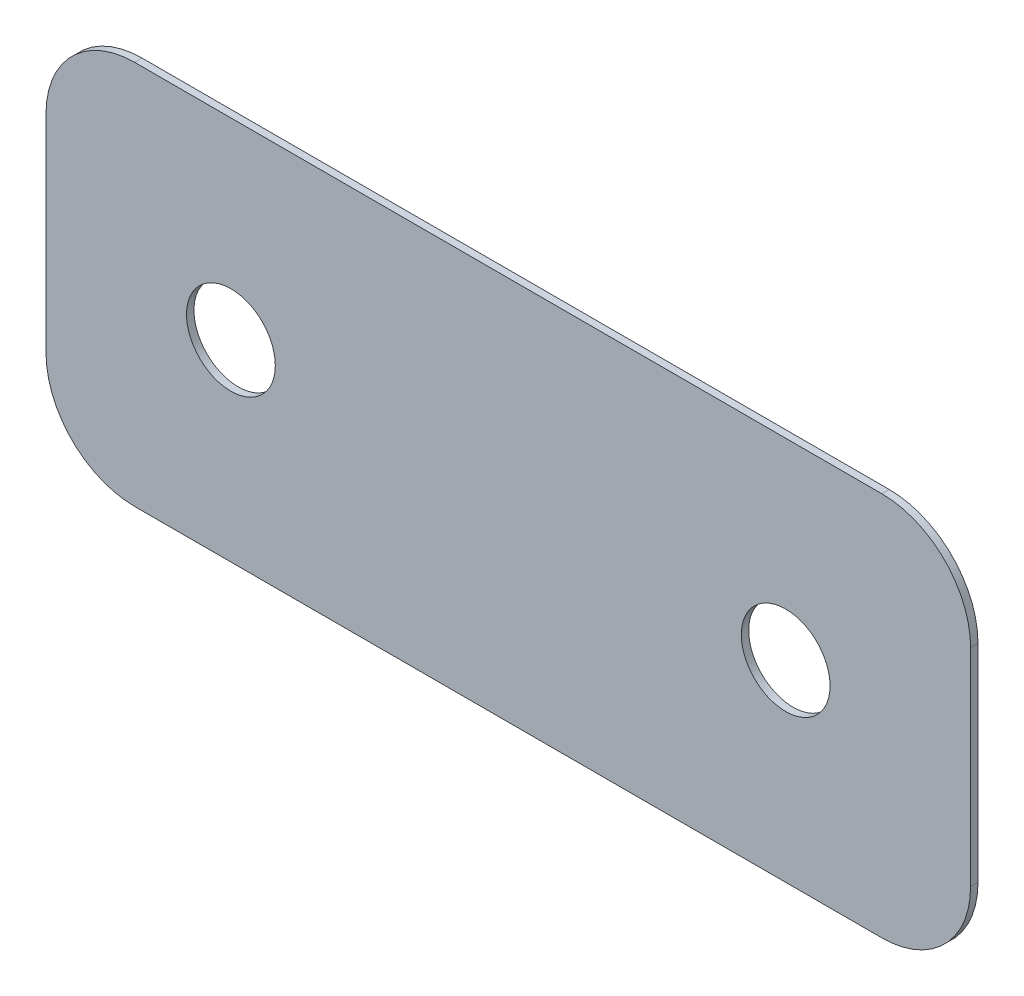
ISO-10303-21;
HEADER;
FILE_DESCRIPTION(('STEP AP214'),'2;1');
FILE_NAME('part.step','',(''),(''),'','','');
FILE_SCHEMA(('AUTOMOTIVE_DESIGN { 1 0 10303 214 1 1 1 1 }'));
ENDSEC;
DATA;
#1=APPLICATION_CONTEXT('core data for automotive mechanical design processes');
#2=APPLICATION_PROTOCOL_DEFINITION('international standard','automotive_design',2000,#1);
#3=PRODUCT_CONTEXT('',#1,'mechanical');
#4=PRODUCT('Part','Part','',(#3));
#5=PRODUCT_RELATED_PRODUCT_CATEGORY('part','',(#4));
#6=PRODUCT_DEFINITION_FORMATION('','',#4);
#7=PRODUCT_DEFINITION_CONTEXT('part definition',#1,'design');
#8=PRODUCT_DEFINITION('design','',#6,#7);
#9=PRODUCT_DEFINITION_SHAPE('','',#8);
#10=(LENGTH_UNIT() NAMED_UNIT(*) SI_UNIT(.MILLI.,.METRE.));
#11=(NAMED_UNIT(*) PLANE_ANGLE_UNIT() SI_UNIT($,.RADIAN.));
#12=(NAMED_UNIT(*) SI_UNIT($,.STERADIAN.) SOLID_ANGLE_UNIT());
#13=UNCERTAINTY_MEASURE_WITH_UNIT(LENGTH_MEASURE(1.E-05),#10,'distance_accuracy_value','');
#14=(GEOMETRIC_REPRESENTATION_CONTEXT(3) GLOBAL_UNCERTAINTY_ASSIGNED_CONTEXT((#13)) GLOBAL_UNIT_ASSIGNED_CONTEXT((#10,
#11,#12)) REPRESENTATION_CONTEXT('',''));
#15=CARTESIAN_POINT('',(0.,0.,0.));
#16=DIRECTION('',(0.,0.,1.));
#17=DIRECTION('',(1.,0.,0.));
#18=AXIS2_PLACEMENT_3D('',#15,#16,#17);
#19=CARTESIAN_POINT('',(50.5,14.,1.));
#20=DIRECTION('',(0.,0.,-1.));
#21=DIRECTION('',(-1.,0.,0.));
#22=AXIS2_PLACEMENT_3D('',#19,#20,#21);
#23=PLANE('',#22);
#24=CARTESIAN_POINT('',(50.5,14.,1.));
#25=DIRECTION('',(0.,0.,1.));
#26=DIRECTION('',(-1.,0.,0.));
#27=AXIS2_PLACEMENT_3D('',#24,#25,#26);
#28=CIRCLE('',#27,12.);
#29=CARTESIAN_POINT('',(62.5,13.9999999999999,1.));
#30=VERTEX_POINT('',#29);
#31=CARTESIAN_POINT('',(50.4999999999999,26.,1.));
#32=VERTEX_POINT('',#31);
#33=EDGE_CURVE('E152',#30,#32,#28,.T.);
#34=ORIENTED_EDGE('',*,*,#33,.T.);
#35=DIRECTION('',(-1.,0.,0.));
#36=VECTOR('',#35,1.);
#37=CARTESIAN_POINT('',(-50.4999999999999,26.,1.));
#38=LINE('',#37,#36);
#39=CARTESIAN_POINT('',(-50.4999999999999,26.,1.));
#40=VERTEX_POINT('',#39);
#41=EDGE_CURVE('E98',#32,#40,#38,.T.);
#42=ORIENTED_EDGE('',*,*,#41,.T.);
#43=CARTESIAN_POINT('',(-50.5,14.,1.));
#44=DIRECTION('',(0.,0.,1.));
#45=DIRECTION('',(1.,0.,0.));
#46=AXIS2_PLACEMENT_3D('',#43,#44,#45);
#47=CIRCLE('',#46,12.);
#48=CARTESIAN_POINT('',(-62.5,13.9999999999999,1.));
#49=VERTEX_POINT('',#48);
#50=EDGE_CURVE('E168',#40,#49,#47,.T.);
#51=ORIENTED_EDGE('',*,*,#50,.T.);
#52=DIRECTION('',(0.,-1.,0.));
#53=VECTOR('',#52,1.);
#54=CARTESIAN_POINT('',(-62.5,13.9999999999999,1.));
#55=LINE('',#54,#53);
#56=CARTESIAN_POINT('',(-62.5,-13.9999999999999,1.));
#57=VERTEX_POINT('',#56);
#58=EDGE_CURVE('E177',#49,#57,#55,.T.);
#59=ORIENTED_EDGE('',*,*,#58,.T.);
#60=CARTESIAN_POINT('',(-50.5,-14.,1.));
#61=DIRECTION('',(0.,0.,1.));
#62=DIRECTION('',(1.,0.,0.));
#63=AXIS2_PLACEMENT_3D('',#60,#61,#62);
#64=CIRCLE('',#63,12.);
#65=CARTESIAN_POINT('',(-50.4999999999999,-26.,1.));
#66=VERTEX_POINT('',#65);
#67=EDGE_CURVE('E120',#57,#66,#64,.T.);
#68=ORIENTED_EDGE('',*,*,#67,.T.);
#69=DIRECTION('',(1.,0.,0.));
#70=VECTOR('',#69,1.);
#71=CARTESIAN_POINT('',(-50.4999999999999,-26.,1.));
#72=LINE('',#71,#70);
#73=CARTESIAN_POINT('',(50.4999999999999,-26.,1.));
#74=VERTEX_POINT('',#73);
#75=EDGE_CURVE('E115',#66,#74,#72,.T.);
#76=ORIENTED_EDGE('',*,*,#75,.T.);
#77=CARTESIAN_POINT('',(50.5,-14.,1.));
#78=DIRECTION('',(0.,0.,1.));
#79=DIRECTION('',(1.,0.,0.));
#80=AXIS2_PLACEMENT_3D('',#77,#78,#79);
#81=CIRCLE('',#80,12.);
#82=CARTESIAN_POINT('',(62.5,-14.,1.));
#83=VERTEX_POINT('',#82);
#84=EDGE_CURVE('E117',#74,#83,#81,.T.);
#85=ORIENTED_EDGE('',*,*,#84,.T.);
#86=DIRECTION('',(0.,1.,0.));
#87=VECTOR('',#86,1.);
#88=CARTESIAN_POINT('',(62.5,13.9999999999999,1.));
#89=LINE('',#88,#87);
#90=EDGE_CURVE('E57',#83,#30,#89,.T.);
#91=ORIENTED_EDGE('',*,*,#90,.T.);
#92=EDGE_LOOP('',(#34,#42,#51,#59,#68,#76,#85,#91));
#93=FACE_BOUND('',#92,.T.);
#94=CARTESIAN_POINT('',(-37.5,0.,1.));
#95=DIRECTION('',(0.,0.,1.));
#96=DIRECTION('',(1.,0.,0.));
#97=AXIS2_PLACEMENT_3D('',#94,#95,#96);
#98=CIRCLE('',#97,5.99999999999999);
#99=CARTESIAN_POINT('',(-31.5,0.,1.));
#100=VERTEX_POINT('',#99);
#101=EDGE_CURVE('E139',#100,#100,#98,.T.);
#102=ORIENTED_EDGE('',*,*,#101,.F.);
#103=EDGE_LOOP('',(#102));
#104=FACE_BOUND('',#103,.T.);
#105=CARTESIAN_POINT('',(37.5,0.,1.));
#106=DIRECTION('',(0.,0.,1.));
#107=DIRECTION('',(1.,0.,0.));
#108=AXIS2_PLACEMENT_3D('',#105,#106,#107);
#109=CIRCLE('',#108,6.00000000000001);
#110=CARTESIAN_POINT('',(43.5,0.,1.));
#111=VERTEX_POINT('',#110);
#112=EDGE_CURVE('E187',#111,#111,#109,.T.);
#113=ORIENTED_EDGE('',*,*,#112,.F.);
#114=EDGE_LOOP('',(#113));
#115=FACE_BOUND('',#114,.T.);
#116=ADVANCED_FACE('F39',(#93,#104,#115),#23,.F.);
#117=CARTESIAN_POINT('',(50.5,14.,0.));
#118=DIRECTION('',(0.,0.,-1.));
#119=DIRECTION('',(-1.,0.,0.));
#120=AXIS2_PLACEMENT_3D('',#117,#118,#119);
#121=PLANE('',#120);
#122=CARTESIAN_POINT('',(-37.5,0.,0.));
#123=DIRECTION('',(0.,0.,1.));
#124=DIRECTION('',(1.,0.,0.));
#125=AXIS2_PLACEMENT_3D('',#122,#123,#124);
#126=CIRCLE('',#125,5.99999999999999);
#127=CARTESIAN_POINT('',(-31.5,0.,0.));
#128=VERTEX_POINT('',#127);
#129=EDGE_CURVE('E184',#128,#128,#126,.T.);
#130=ORIENTED_EDGE('',*,*,#129,.T.);
#131=EDGE_LOOP('',(#130));
#132=FACE_BOUND('',#131,.T.);
#133=CARTESIAN_POINT('',(50.5,14.,0.));
#134=DIRECTION('',(0.,0.,1.));
#135=DIRECTION('',(-1.,0.,0.));
#136=AXIS2_PLACEMENT_3D('',#133,#134,#135);
#137=CIRCLE('',#136,12.);
#138=CARTESIAN_POINT('',(62.5,13.9999999999999,0.));
#139=VERTEX_POINT('',#138);
#140=CARTESIAN_POINT('',(50.4999999999999,26.,0.));
#141=VERTEX_POINT('',#140);
#142=EDGE_CURVE('E136',#139,#141,#137,.T.);
#143=ORIENTED_EDGE('',*,*,#142,.F.);
#144=DIRECTION('',(0.,1.,0.));
#145=VECTOR('',#144,1.);
#146=CARTESIAN_POINT('',(62.5,13.9999999999999,0.));
#147=LINE('',#146,#145);
#148=CARTESIAN_POINT('',(62.5,-14.,0.));
#149=VERTEX_POINT('',#148);
#150=EDGE_CURVE('E91',#149,#139,#147,.T.);
#151=ORIENTED_EDGE('',*,*,#150,.F.);
#152=CARTESIAN_POINT('',(50.5,-14.,0.));
#153=DIRECTION('',(0.,0.,1.));
#154=DIRECTION('',(1.,0.,0.));
#155=AXIS2_PLACEMENT_3D('',#152,#153,#154);
#156=CIRCLE('',#155,12.);
#157=CARTESIAN_POINT('',(50.4999999999999,-26.,0.));
#158=VERTEX_POINT('',#157);
#159=EDGE_CURVE('E82',#158,#149,#156,.T.);
#160=ORIENTED_EDGE('',*,*,#159,.F.);
#161=DIRECTION('',(1.,0.,0.));
#162=VECTOR('',#161,1.);
#163=CARTESIAN_POINT('',(-50.4999999999999,-26.,0.));
#164=LINE('',#163,#162);
#165=CARTESIAN_POINT('',(-50.4999999999999,-26.,0.));
#166=VERTEX_POINT('',#165);
#167=EDGE_CURVE('E128',#166,#158,#164,.T.);
#168=ORIENTED_EDGE('',*,*,#167,.F.);
#169=CARTESIAN_POINT('',(-50.5,-14.,0.));
#170=DIRECTION('',(0.,0.,1.));
#171=DIRECTION('',(1.,0.,0.));
#172=AXIS2_PLACEMENT_3D('',#169,#170,#171);
#173=CIRCLE('',#172,12.);
#174=CARTESIAN_POINT('',(-62.5,-13.9999999999999,0.));
#175=VERTEX_POINT('',#174);
#176=EDGE_CURVE('E147',#175,#166,#173,.T.);
#177=ORIENTED_EDGE('',*,*,#176,.F.);
#178=DIRECTION('',(0.,-1.,0.));
#179=VECTOR('',#178,1.);
#180=CARTESIAN_POINT('',(-62.5,13.9999999999999,0.));
#181=LINE('',#180,#179);
#182=CARTESIAN_POINT('',(-62.5,13.9999999999999,0.));
#183=VERTEX_POINT('',#182);
#184=EDGE_CURVE('E143',#183,#175,#181,.T.);
#185=ORIENTED_EDGE('',*,*,#184,.F.);
#186=CARTESIAN_POINT('',(-50.5,14.,0.));
#187=DIRECTION('',(0.,0.,1.));
#188=DIRECTION('',(1.,0.,0.));
#189=AXIS2_PLACEMENT_3D('',#186,#187,#188);
#190=CIRCLE('',#189,12.);
#191=CARTESIAN_POINT('',(-50.4999999999999,26.,0.));
#192=VERTEX_POINT('',#191);
#193=EDGE_CURVE('E145',#192,#183,#190,.T.);
#194=ORIENTED_EDGE('',*,*,#193,.F.);
#195=DIRECTION('',(-1.,0.,0.));
#196=VECTOR('',#195,1.);
#197=CARTESIAN_POINT('',(-50.4999999999999,26.,0.));
#198=LINE('',#197,#196);
#199=EDGE_CURVE('E137',#141,#192,#198,.T.);
#200=ORIENTED_EDGE('',*,*,#199,.F.);
#201=EDGE_LOOP('',(#143,#151,#160,#168,#177,#185,#194,#200));
#202=FACE_BOUND('',#201,.T.);
#203=CARTESIAN_POINT('',(37.5,0.,0.));
#204=DIRECTION('',(0.,0.,1.));
#205=DIRECTION('',(1.,0.,0.));
#206=AXIS2_PLACEMENT_3D('',#203,#204,#205);
#207=CIRCLE('',#206,6.00000000000001);
#208=CARTESIAN_POINT('',(43.5,0.,0.));
#209=VERTEX_POINT('',#208);
#210=EDGE_CURVE('E192',#209,#209,#207,.T.);
#211=ORIENTED_EDGE('',*,*,#210,.T.);
#212=EDGE_LOOP('',(#211));
#213=FACE_BOUND('',#212,.T.);
#214=ADVANCED_FACE('F169',(#132,#202,#213),#121,.T.);
#215=CARTESIAN_POINT('',(50.5,14.,1.));
#216=DIRECTION('',(0.,0.,-1.));
#217=DIRECTION('',(-1.,0.,0.));
#218=AXIS2_PLACEMENT_3D('',#215,#216,#217);
#219=CYLINDRICAL_SURFACE('',#218,12.);
#220=ORIENTED_EDGE('',*,*,#142,.T.);
#221=DIRECTION('',(0.,0.,-1.));
#222=VECTOR('',#221,1.);
#223=CARTESIAN_POINT('',(50.4999999999999,26.,1.));
#224=LINE('',#223,#222);
#225=EDGE_CURVE('E11',#32,#141,#224,.T.);
#226=ORIENTED_EDGE('',*,*,#225,.F.);
#227=ORIENTED_EDGE('',*,*,#33,.F.);
#228=DIRECTION('',(0.,0.,-1.));
#229=VECTOR('',#228,1.);
#230=CARTESIAN_POINT('',(62.5,13.9999999999999,1.));
#231=LINE('',#230,#229);
#232=EDGE_CURVE('E135',#30,#139,#231,.T.);
#233=ORIENTED_EDGE('',*,*,#232,.T.);
#234=EDGE_LOOP('',(#220,#226,#227,#233));
#235=FACE_BOUND('',#234,.T.);
#236=ADVANCED_FACE('F41',(#235),#219,.T.);
#237=CARTESIAN_POINT('',(-50.4999999999999,26.,1.));
#238=DIRECTION('',(0.,-1.,0.));
#239=DIRECTION('',(0.,0.,-1.));
#240=AXIS2_PLACEMENT_3D('',#237,#238,#239);
#241=PLANE('',#240);
#242=ORIENTED_EDGE('',*,*,#199,.T.);
#243=DIRECTION('',(0.,0.,-1.));
#244=VECTOR('',#243,1.);
#245=CARTESIAN_POINT('',(-50.4999999999999,26.,1.));
#246=LINE('',#245,#244);
#247=EDGE_CURVE('E48',#40,#192,#246,.T.);
#248=ORIENTED_EDGE('',*,*,#247,.F.);
#249=ORIENTED_EDGE('',*,*,#41,.F.);
#250=ORIENTED_EDGE('',*,*,#225,.T.);
#251=EDGE_LOOP('',(#242,#248,#249,#250));
#252=FACE_BOUND('',#251,.T.);
#253=ADVANCED_FACE('F223',(#252),#241,.F.);
#254=CARTESIAN_POINT('',(-50.5,14.,1.));
#255=DIRECTION('',(0.,0.,-1.));
#256=DIRECTION('',(-1.,0.,0.));
#257=AXIS2_PLACEMENT_3D('',#254,#255,#256);
#258=CYLINDRICAL_SURFACE('',#257,12.);
#259=ORIENTED_EDGE('',*,*,#193,.T.);
#260=DIRECTION('',(0.,0.,-1.));
#261=VECTOR('',#260,1.);
#262=CARTESIAN_POINT('',(-62.5,13.9999999999999,1.));
#263=LINE('',#262,#261);
#264=EDGE_CURVE('E156',#49,#183,#263,.T.);
#265=ORIENTED_EDGE('',*,*,#264,.F.);
#266=ORIENTED_EDGE('',*,*,#50,.F.);
#267=ORIENTED_EDGE('',*,*,#247,.T.);
#268=EDGE_LOOP('',(#259,#265,#266,#267));
#269=FACE_BOUND('',#268,.T.);
#270=ADVANCED_FACE('F161',(#269),#258,.T.);
#271=CARTESIAN_POINT('',(-62.5,13.9999999999999,1.));
#272=DIRECTION('',(1.,0.,0.));
#273=DIRECTION('',(0.,1.,0.));
#274=AXIS2_PLACEMENT_3D('',#271,#272,#273);
#275=PLANE('',#274);
#276=ORIENTED_EDGE('',*,*,#184,.T.);
#277=DIRECTION('',(0.,0.,-1.));
#278=VECTOR('',#277,1.);
#279=CARTESIAN_POINT('',(-62.5,-13.9999999999999,1.));
#280=LINE('',#279,#278);
#281=EDGE_CURVE('E153',#57,#175,#280,.T.);
#282=ORIENTED_EDGE('',*,*,#281,.F.);
#283=ORIENTED_EDGE('',*,*,#58,.F.);
#284=ORIENTED_EDGE('',*,*,#264,.T.);
#285=EDGE_LOOP('',(#276,#282,#283,#284));
#286=FACE_BOUND('',#285,.T.);
#287=ADVANCED_FACE('F172',(#286),#275,.F.);
#288=CARTESIAN_POINT('',(-50.5,-14.,1.));
#289=DIRECTION('',(0.,0.,-1.));
#290=DIRECTION('',(-1.,0.,0.));
#291=AXIS2_PLACEMENT_3D('',#288,#289,#290);
#292=CYLINDRICAL_SURFACE('',#291,12.);
#293=ORIENTED_EDGE('',*,*,#176,.T.);
#294=DIRECTION('',(0.,0.,-1.));
#295=VECTOR('',#294,1.);
#296=CARTESIAN_POINT('',(-50.4999999999999,-26.,1.));
#297=LINE('',#296,#295);
#298=EDGE_CURVE('E130',#66,#166,#297,.T.);
#299=ORIENTED_EDGE('',*,*,#298,.F.);
#300=ORIENTED_EDGE('',*,*,#67,.F.);
#301=ORIENTED_EDGE('',*,*,#281,.T.);
#302=EDGE_LOOP('',(#293,#299,#300,#301));
#303=FACE_BOUND('',#302,.T.);
#304=ADVANCED_FACE('F178',(#303),#292,.T.);
#305=CARTESIAN_POINT('',(-50.4999999999999,-26.,1.));
#306=DIRECTION('',(0.,1.,0.));
#307=DIRECTION('',(0.,0.,1.));
#308=AXIS2_PLACEMENT_3D('',#305,#306,#307);
#309=PLANE('',#308);
#310=ORIENTED_EDGE('',*,*,#167,.T.);
#311=DIRECTION('',(0.,0.,-1.));
#312=VECTOR('',#311,1.);
#313=CARTESIAN_POINT('',(50.4999999999999,-26.,1.));
#314=LINE('',#313,#312);
#315=EDGE_CURVE('E121',#74,#158,#314,.T.);
#316=ORIENTED_EDGE('',*,*,#315,.F.);
#317=ORIENTED_EDGE('',*,*,#75,.F.);
#318=ORIENTED_EDGE('',*,*,#298,.T.);
#319=EDGE_LOOP('',(#310,#316,#317,#318));
#320=FACE_BOUND('',#319,.T.);
#321=ADVANCED_FACE('F125',(#320),#309,.F.);
#322=CARTESIAN_POINT('',(50.5,-14.,1.));
#323=DIRECTION('',(0.,0.,-1.));
#324=DIRECTION('',(-1.,0.,0.));
#325=AXIS2_PLACEMENT_3D('',#322,#323,#324);
#326=CYLINDRICAL_SURFACE('',#325,12.);
#327=ORIENTED_EDGE('',*,*,#159,.T.);
#328=DIRECTION('',(0.,0.,-1.));
#329=VECTOR('',#328,1.);
#330=CARTESIAN_POINT('',(62.5,-14.,1.));
#331=LINE('',#330,#329);
#332=EDGE_CURVE('E126',#83,#149,#331,.T.);
#333=ORIENTED_EDGE('',*,*,#332,.F.);
#334=ORIENTED_EDGE('',*,*,#84,.F.);
#335=ORIENTED_EDGE('',*,*,#315,.T.);
#336=EDGE_LOOP('',(#327,#333,#334,#335));
#337=FACE_BOUND('',#336,.T.);
#338=ADVANCED_FACE('F127',(#337),#326,.T.);
#339=CARTESIAN_POINT('',(62.5,13.9999999999999,1.));
#340=DIRECTION('',(-1.,0.,0.));
#341=DIRECTION('',(0.,-1.,0.));
#342=AXIS2_PLACEMENT_3D('',#339,#340,#341);
#343=PLANE('',#342);
#344=ORIENTED_EDGE('',*,*,#150,.T.);
#345=ORIENTED_EDGE('',*,*,#232,.F.);
#346=ORIENTED_EDGE('',*,*,#90,.F.);
#347=ORIENTED_EDGE('',*,*,#332,.T.);
#348=EDGE_LOOP('',(#344,#345,#346,#347));
#349=FACE_BOUND('',#348,.T.);
#350=ADVANCED_FACE('F213',(#349),#343,.F.);
#351=CARTESIAN_POINT('',(-37.5,0.,1.));
#352=DIRECTION('',(0.,0.,-1.));
#353=DIRECTION('',(-1.,0.,0.));
#354=AXIS2_PLACEMENT_3D('',#351,#352,#353);
#355=CYLINDRICAL_SURFACE('',#354,5.99999999999999);
#356=ORIENTED_EDGE('',*,*,#101,.T.);
#357=EDGE_LOOP('',(#356));
#358=FACE_BOUND('',#357,.T.);
#359=ORIENTED_EDGE('',*,*,#129,.F.);
#360=EDGE_LOOP('',(#359));
#361=FACE_BOUND('',#360,.T.);
#362=ADVANCED_FACE('F210',(#358,#361),#355,.F.);
#363=CARTESIAN_POINT('',(37.5,0.,1.));
#364=DIRECTION('',(0.,0.,-1.));
#365=DIRECTION('',(-1.,0.,0.));
#366=AXIS2_PLACEMENT_3D('',#363,#364,#365);
#367=CYLINDRICAL_SURFACE('',#366,6.00000000000001);
#368=ORIENTED_EDGE('',*,*,#112,.T.);
#369=EDGE_LOOP('',(#368));
#370=FACE_BOUND('',#369,.T.);
#371=ORIENTED_EDGE('',*,*,#210,.F.);
#372=EDGE_LOOP('',(#371));
#373=FACE_BOUND('',#372,.T.);
#374=ADVANCED_FACE('F199',(#370,#373),#367,.F.);
#375=CLOSED_SHELL('',(#116,#214,#236,#253,#270,#287,#304,#321,#338,#350,#362,#374));
#376=MANIFOLD_SOLID_BREP('B2',#375);
#377=ADVANCED_BREP_SHAPE_REPRESENTATION('',(#18,#376),#14);
#378=SHAPE_DEFINITION_REPRESENTATION(#9,#377);
ENDSEC;
END-ISO-10303-21;
